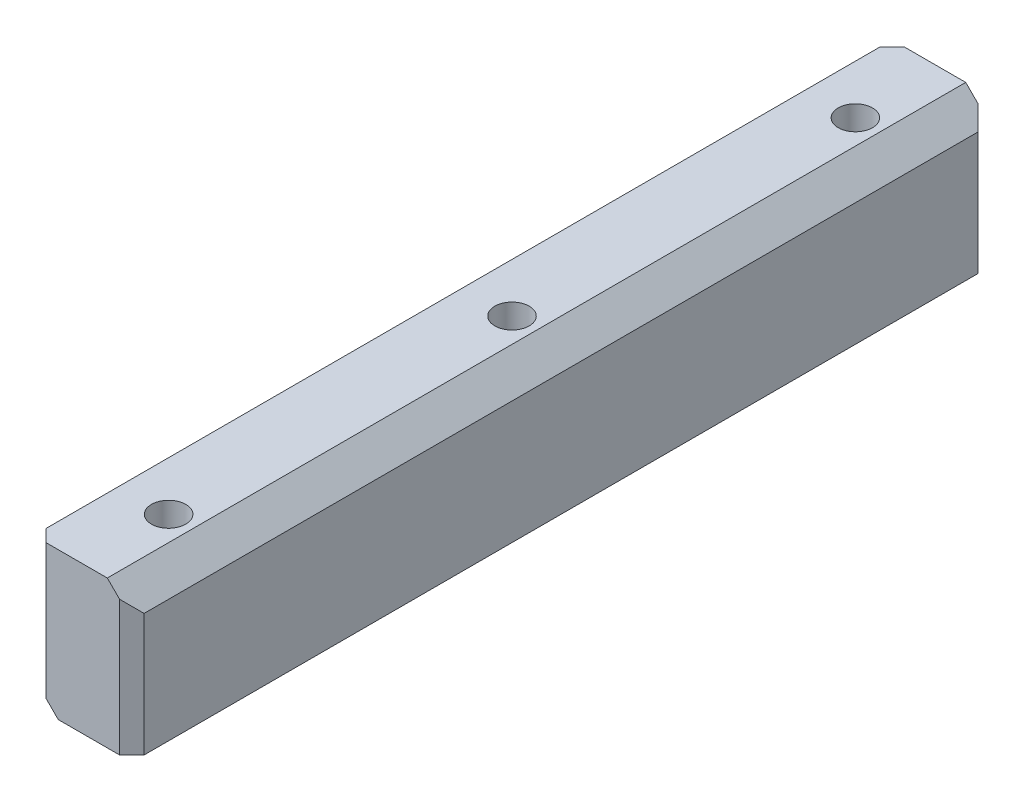
ISO-10303-21;
HEADER;
FILE_DESCRIPTION(('STEP AP214'),'2;1');
FILE_NAME('part.step','',(''),(''),'','','');
FILE_SCHEMA(('AUTOMOTIVE_DESIGN { 1 0 10303 214 1 1 1 1 }'));
ENDSEC;
DATA;
#1=APPLICATION_CONTEXT('core data for automotive mechanical design processes');
#2=APPLICATION_PROTOCOL_DEFINITION('international standard','automotive_design',2000,#1);
#3=PRODUCT_CONTEXT('',#1,'mechanical');
#4=PRODUCT('Part','Part','',(#3));
#5=PRODUCT_RELATED_PRODUCT_CATEGORY('part','',(#4));
#6=PRODUCT_DEFINITION_FORMATION('','',#4);
#7=PRODUCT_DEFINITION_CONTEXT('part definition',#1,'design');
#8=PRODUCT_DEFINITION('design','',#6,#7);
#9=PRODUCT_DEFINITION_SHAPE('','',#8);
#10=(LENGTH_UNIT() NAMED_UNIT(*) SI_UNIT(.MILLI.,.METRE.));
#11=(NAMED_UNIT(*) PLANE_ANGLE_UNIT() SI_UNIT($,.RADIAN.));
#12=(NAMED_UNIT(*) SI_UNIT($,.STERADIAN.) SOLID_ANGLE_UNIT());
#13=UNCERTAINTY_MEASURE_WITH_UNIT(LENGTH_MEASURE(1.E-05),#10,'distance_accuracy_value','');
#14=(GEOMETRIC_REPRESENTATION_CONTEXT(3) GLOBAL_UNCERTAINTY_ASSIGNED_CONTEXT((#13)) GLOBAL_UNIT_ASSIGNED_CONTEXT((#10,
#11,#12)) REPRESENTATION_CONTEXT('',''));
#15=CARTESIAN_POINT('',(0.,0.,0.));
#16=DIRECTION('',(0.,0.,1.));
#17=DIRECTION('',(1.,0.,0.));
#18=AXIS2_PLACEMENT_3D('',#15,#16,#17);
#19=CARTESIAN_POINT('',(0.,0.,350.));
#20=DIRECTION('',(0.,-1.,0.));
#21=DIRECTION('',(0.,0.,-1.));
#22=AXIS2_PLACEMENT_3D('',#19,#20,#21);
#23=PLANE('',#22);
#24=CARTESIAN_POINT('',(20.,0.,315.));
#25=DIRECTION('',(0.,1.,0.));
#26=DIRECTION('',(0.,0.,1.));
#27=AXIS2_PLACEMENT_3D('',#24,#25,#26);
#28=CIRCLE('',#27,6.99999999999999);
#29=CARTESIAN_POINT('',(20.,0.,322.));
#30=VERTEX_POINT('',#29);
#31=EDGE_CURVE('E268',#30,#30,#28,.T.);
#32=ORIENTED_EDGE('',*,*,#31,.F.);
#33=EDGE_LOOP('',(#32));
#34=FACE_BOUND('',#33,.T.);
#35=CARTESIAN_POINT('',(20.,0.,34.9999999999999));
#36=DIRECTION('',(0.,1.,0.));
#37=DIRECTION('',(0.,0.,1.));
#38=AXIS2_PLACEMENT_3D('',#35,#36,#37);
#39=CIRCLE('',#38,6.99999999999999);
#40=CARTESIAN_POINT('',(20.,0.,41.9999999999999));
#41=VERTEX_POINT('',#40);
#42=EDGE_CURVE('E149',#41,#41,#39,.T.);
#43=ORIENTED_EDGE('',*,*,#42,.F.);
#44=EDGE_LOOP('',(#43));
#45=FACE_BOUND('',#44,.T.);
#46=DIRECTION('',(-1.,0.,0.));
#47=VECTOR('',#46,1.);
#48=CARTESIAN_POINT('',(0.,0.,0.));
#49=LINE('',#48,#47);
#50=CARTESIAN_POINT('',(29.9999999999999,0.,0.));
#51=VERTEX_POINT('',#50);
#52=CARTESIAN_POINT('',(5.,0.,0.));
#53=VERTEX_POINT('',#52);
#54=EDGE_CURVE('E143',#51,#53,#49,.T.);
#55=ORIENTED_EDGE('',*,*,#54,.T.);
#56=DIRECTION('',(0.707106781186551,0.,-0.707106781186544));
#57=VECTOR('',#56,1.);
#58=CARTESIAN_POINT('',(0.,0.,4.99999999999995));
#59=LINE('',#58,#57);
#60=CARTESIAN_POINT('',(0.,0.,4.99999999999995));
#61=VERTEX_POINT('',#60);
#62=EDGE_CURVE('E197',#53,#61,#59,.F.);
#63=ORIENTED_EDGE('',*,*,#62,.T.);
#64=DIRECTION('',(0.,0.,-1.));
#65=VECTOR('',#64,1.);
#66=CARTESIAN_POINT('',(0.,0.,350.));
#67=LINE('',#66,#65);
#68=CARTESIAN_POINT('',(0.,0.,345.));
#69=VERTEX_POINT('',#68);
#70=EDGE_CURVE('E155',#69,#61,#67,.T.);
#71=ORIENTED_EDGE('',*,*,#70,.F.);
#72=DIRECTION('',(0.707106781186544,0.,0.707106781186551));
#73=VECTOR('',#72,1.);
#74=CARTESIAN_POINT('',(4.99999999999995,0.,350.));
#75=LINE('',#74,#73);
#76=CARTESIAN_POINT('',(4.99999999999995,0.,350.));
#77=VERTEX_POINT('',#76);
#78=EDGE_CURVE('E51',#69,#77,#75,.T.);
#79=ORIENTED_EDGE('',*,*,#78,.T.);
#80=DIRECTION('',(-1.,0.,0.));
#81=VECTOR('',#80,1.);
#82=CARTESIAN_POINT('',(0.,0.,350.));
#83=LINE('',#82,#81);
#84=CARTESIAN_POINT('',(29.9999999999999,0.,350.));
#85=VERTEX_POINT('',#84);
#86=EDGE_CURVE('E152',#85,#77,#83,.T.);
#87=ORIENTED_EDGE('',*,*,#86,.F.);
#88=DIRECTION('',(0.,0.,-1.));
#89=VECTOR('',#88,1.);
#90=CARTESIAN_POINT('',(29.9999999999999,0.,350.));
#91=LINE('',#90,#89);
#92=EDGE_CURVE('E167',#85,#51,#91,.T.);
#93=ORIENTED_EDGE('',*,*,#92,.T.);
#94=EDGE_LOOP('',(#55,#63,#71,#79,#87,#93));
#95=FACE_BOUND('',#94,.T.);
#96=CARTESIAN_POINT('',(20.,0.,175.));
#97=DIRECTION('',(0.,1.,0.));
#98=DIRECTION('',(0.,0.,1.));
#99=AXIS2_PLACEMENT_3D('',#96,#97,#98);
#100=CIRCLE('',#99,6.99999999999999);
#101=CARTESIAN_POINT('',(20.,0.,182.));
#102=VERTEX_POINT('',#101);
#103=EDGE_CURVE('E262',#102,#102,#100,.T.);
#104=ORIENTED_EDGE('',*,*,#103,.F.);
#105=EDGE_LOOP('',(#104));
#106=FACE_BOUND('',#105,.T.);
#107=ADVANCED_FACE('F36',(#34,#45,#95,#106),#23,.F.);
#108=CARTESIAN_POINT('',(0.,0.,350.));
#109=DIRECTION('',(1.,0.,0.));
#110=DIRECTION('',(0.,1.,0.));
#111=AXIS2_PLACEMENT_3D('',#108,#109,#110);
#112=PLANE('',#111);
#113=ORIENTED_EDGE('',*,*,#70,.T.);
#114=DIRECTION('',(0.,-1.,0.));
#115=VECTOR('',#114,1.);
#116=CARTESIAN_POINT('',(0.,0.,4.99999999999995));
#117=LINE('',#116,#115);
#118=CARTESIAN_POINT('',(0.,-50.,4.99999999999995));
#119=VERTEX_POINT('',#118);
#120=EDGE_CURVE('E191',#61,#119,#117,.T.);
#121=ORIENTED_EDGE('',*,*,#120,.T.);
#122=DIRECTION('',(0.,0.,1.));
#123=VECTOR('',#122,1.);
#124=CARTESIAN_POINT('',(0.,-50.,350.));
#125=LINE('',#124,#123);
#126=CARTESIAN_POINT('',(0.,-50.,345.));
#127=VERTEX_POINT('',#126);
#128=EDGE_CURVE('E126',#119,#127,#125,.T.);
#129=ORIENTED_EDGE('',*,*,#128,.T.);
#130=DIRECTION('',(0.,1.,0.));
#131=VECTOR('',#130,1.);
#132=CARTESIAN_POINT('',(0.,0.,345.));
#133=LINE('',#132,#131);
#134=EDGE_CURVE('E189',#127,#69,#133,.T.);
#135=ORIENTED_EDGE('',*,*,#134,.T.);
#136=EDGE_LOOP('',(#113,#121,#129,#135));
#137=FACE_BOUND('',#136,.T.);
#138=ADVANCED_FACE('F201',(#137),#112,.F.);
#139=CARTESIAN_POINT('',(0.,-60.,350.));
#140=DIRECTION('',(0.,1.,0.));
#141=DIRECTION('',(0.,0.,1.));
#142=AXIS2_PLACEMENT_3D('',#139,#140,#141);
#143=PLANE('',#142);
#144=CARTESIAN_POINT('',(20.,-60.,315.));
#145=DIRECTION('',(0.,1.,0.));
#146=DIRECTION('',(0.,0.,1.));
#147=AXIS2_PLACEMENT_3D('',#144,#145,#146);
#148=CIRCLE('',#147,6.99999999999999);
#149=CARTESIAN_POINT('',(20.,-60.,322.));
#150=VERTEX_POINT('',#149);
#151=EDGE_CURVE('E265',#150,#150,#148,.T.);
#152=ORIENTED_EDGE('',*,*,#151,.T.);
#153=EDGE_LOOP('',(#152));
#154=FACE_BOUND('',#153,.T.);
#155=CARTESIAN_POINT('',(20.,-60.,175.));
#156=DIRECTION('',(0.,1.,0.));
#157=DIRECTION('',(0.,0.,1.));
#158=AXIS2_PLACEMENT_3D('',#155,#156,#157);
#159=CIRCLE('',#158,6.99999999999999);
#160=CARTESIAN_POINT('',(20.,-60.,182.));
#161=VERTEX_POINT('',#160);
#162=EDGE_CURVE('E259',#161,#161,#159,.T.);
#163=ORIENTED_EDGE('',*,*,#162,.T.);
#164=EDGE_LOOP('',(#163));
#165=FACE_BOUND('',#164,.T.);
#166=CARTESIAN_POINT('',(20.,-60.,34.9999999999999));
#167=DIRECTION('',(0.,1.,0.));
#168=DIRECTION('',(0.,0.,1.));
#169=AXIS2_PLACEMENT_3D('',#166,#167,#168);
#170=CIRCLE('',#169,6.99999999999999);
#171=CARTESIAN_POINT('',(20.,-60.,41.9999999999999));
#172=VERTEX_POINT('',#171);
#173=EDGE_CURVE('E144',#172,#172,#170,.T.);
#174=ORIENTED_EDGE('',*,*,#173,.T.);
#175=EDGE_LOOP('',(#174));
#176=FACE_BOUND('',#175,.T.);
#177=DIRECTION('',(1.,0.,0.));
#178=VECTOR('',#177,1.);
#179=CARTESIAN_POINT('',(0.,-60.,0.));
#180=LINE('',#179,#178);
#181=CARTESIAN_POINT('',(9.99999999999996,-60.,0.));
#182=VERTEX_POINT('',#181);
#183=CARTESIAN_POINT('',(35.,-60.,0.));
#184=VERTEX_POINT('',#183);
#185=EDGE_CURVE('E133',#182,#184,#180,.T.);
#186=ORIENTED_EDGE('',*,*,#185,.T.);
#187=DIRECTION('',(-0.707106781186551,0.,-0.707106781186544));
#188=VECTOR('',#187,1.);
#189=CARTESIAN_POINT('',(40.,-60.,4.99999999999995));
#190=LINE('',#189,#188);
#191=CARTESIAN_POINT('',(40.,-60.,4.99999999999995));
#192=VERTEX_POINT('',#191);
#193=EDGE_CURVE('E187',#184,#192,#190,.F.);
#194=ORIENTED_EDGE('',*,*,#193,.T.);
#195=DIRECTION('',(0.,0.,-1.));
#196=VECTOR('',#195,1.);
#197=CARTESIAN_POINT('',(40.,-60.,350.));
#198=LINE('',#197,#196);
#199=CARTESIAN_POINT('',(40.,-60.,345.));
#200=VERTEX_POINT('',#199);
#201=EDGE_CURVE('E137',#200,#192,#198,.T.);
#202=ORIENTED_EDGE('',*,*,#201,.F.);
#203=DIRECTION('',(-0.707106781186544,0.,0.707106781186551));
#204=VECTOR('',#203,1.);
#205=CARTESIAN_POINT('',(35.0000000000001,-60.,350.));
#206=LINE('',#205,#204);
#207=CARTESIAN_POINT('',(35.0000000000001,-60.,350.));
#208=VERTEX_POINT('',#207);
#209=EDGE_CURVE('E185',#200,#208,#206,.T.);
#210=ORIENTED_EDGE('',*,*,#209,.T.);
#211=DIRECTION('',(1.,0.,0.));
#212=VECTOR('',#211,1.);
#213=CARTESIAN_POINT('',(0.,-60.,350.));
#214=LINE('',#213,#212);
#215=CARTESIAN_POINT('',(9.99999999999996,-60.,350.));
#216=VERTEX_POINT('',#215);
#217=EDGE_CURVE('E136',#216,#208,#214,.T.);
#218=ORIENTED_EDGE('',*,*,#217,.F.);
#219=DIRECTION('',(0.,0.,-1.));
#220=VECTOR('',#219,1.);
#221=CARTESIAN_POINT('',(9.99999999999996,-60.,350.));
#222=LINE('',#221,#220);
#223=EDGE_CURVE('E121',#216,#182,#222,.T.);
#224=ORIENTED_EDGE('',*,*,#223,.T.);
#225=EDGE_LOOP('',(#186,#194,#202,#210,#218,#224));
#226=FACE_BOUND('',#225,.T.);
#227=ADVANCED_FACE('F132',(#154,#165,#176,#226),#143,.F.);
#228=CARTESIAN_POINT('',(40.,0.,350.));
#229=DIRECTION('',(-1.,0.,0.));
#230=DIRECTION('',(0.,-1.,0.));
#231=AXIS2_PLACEMENT_3D('',#228,#229,#230);
#232=PLANE('',#231);
#233=ORIENTED_EDGE('',*,*,#201,.T.);
#234=DIRECTION('',(0.,1.,0.));
#235=VECTOR('',#234,1.);
#236=CARTESIAN_POINT('',(40.,0.,4.99999999999995));
#237=LINE('',#236,#235);
#238=CARTESIAN_POINT('',(40.,-10.0000000000001,4.99999999999995));
#239=VERTEX_POINT('',#238);
#240=EDGE_CURVE('E175',#192,#239,#237,.T.);
#241=ORIENTED_EDGE('',*,*,#240,.T.);
#242=DIRECTION('',(0.,0.,1.));
#243=VECTOR('',#242,1.);
#244=CARTESIAN_POINT('',(40.,-10.0000000000001,350.));
#245=LINE('',#244,#243);
#246=CARTESIAN_POINT('',(40.,-10.0000000000001,345.));
#247=VERTEX_POINT('',#246);
#248=EDGE_CURVE('E170',#239,#247,#245,.T.);
#249=ORIENTED_EDGE('',*,*,#248,.T.);
#250=DIRECTION('',(0.,-1.,0.));
#251=VECTOR('',#250,1.);
#252=CARTESIAN_POINT('',(40.,-60.,345.));
#253=LINE('',#252,#251);
#254=EDGE_CURVE('E173',#247,#200,#253,.T.);
#255=ORIENTED_EDGE('',*,*,#254,.T.);
#256=EDGE_LOOP('',(#233,#241,#249,#255));
#257=FACE_BOUND('',#256,.T.);
#258=ADVANCED_FACE('F222',(#257),#232,.F.);
#259=CARTESIAN_POINT('',(0.,0.,350.));
#260=DIRECTION('',(0.,0.,1.));
#261=DIRECTION('',(1.,0.,0.));
#262=AXIS2_PLACEMENT_3D('',#259,#260,#261);
#263=PLANE('',#262);
#264=ORIENTED_EDGE('',*,*,#217,.T.);
#265=DIRECTION('',(0.,1.,0.));
#266=VECTOR('',#265,1.);
#267=CARTESIAN_POINT('',(35.,-10.0000000000001,350.));
#268=LINE('',#267,#266);
#269=CARTESIAN_POINT('',(35.0000000000001,-5.00000000000012,350.));
#270=VERTEX_POINT('',#269);
#271=EDGE_CURVE('E11',#208,#270,#268,.T.);
#272=ORIENTED_EDGE('',*,*,#271,.T.);
#273=DIRECTION('',(0.707106781186548,-0.707106781186548,0.));
#274=VECTOR('',#273,1.);
#275=CARTESIAN_POINT('',(15.,15.,350.));
#276=LINE('',#275,#274);
#277=EDGE_CURVE('E163',#270,#85,#276,.F.);
#278=ORIENTED_EDGE('',*,*,#277,.T.);
#279=ORIENTED_EDGE('',*,*,#86,.T.);
#280=DIRECTION('',(0.,-1.,0.));
#281=VECTOR('',#280,1.);
#282=CARTESIAN_POINT('',(4.99999999999995,-50.,350.));
#283=LINE('',#282,#281);
#284=CARTESIAN_POINT('',(4.99999999999995,-55.,350.));
#285=VERTEX_POINT('',#284);
#286=EDGE_CURVE('E44',#77,#285,#283,.T.);
#287=ORIENTED_EDGE('',*,*,#286,.T.);
#288=DIRECTION('',(-0.707106781186546,0.707106781186549,0.));
#289=VECTOR('',#288,1.);
#290=CARTESIAN_POINT('',(-25.,-24.9999999999999,350.));
#291=LINE('',#290,#289);
#292=EDGE_CURVE('E165',#285,#216,#291,.F.);
#293=ORIENTED_EDGE('',*,*,#292,.T.);
#294=EDGE_LOOP('',(#264,#272,#278,#279,#287,#293));
#295=FACE_BOUND('',#294,.T.);
#296=ADVANCED_FACE('F199',(#295),#263,.T.);
#297=CARTESIAN_POINT('',(0.,0.,0.));
#298=DIRECTION('',(0.,0.,1.));
#299=DIRECTION('',(1.,0.,0.));
#300=AXIS2_PLACEMENT_3D('',#297,#298,#299);
#301=PLANE('',#300);
#302=DIRECTION('',(-0.707106781186548,0.707106781186548,0.));
#303=VECTOR('',#302,1.);
#304=CARTESIAN_POINT('',(29.9999999999999,0.,0.));
#305=LINE('',#304,#303);
#306=CARTESIAN_POINT('',(35.,-5.00000000000006,0.));
#307=VERTEX_POINT('',#306);
#308=EDGE_CURVE('E127',#51,#307,#305,.F.);
#309=ORIENTED_EDGE('',*,*,#308,.T.);
#310=DIRECTION('',(0.,-1.,0.));
#311=VECTOR('',#310,1.);
#312=CARTESIAN_POINT('',(35.,0.,0.));
#313=LINE('',#312,#311);
#314=EDGE_CURVE('E142',#307,#184,#313,.T.);
#315=ORIENTED_EDGE('',*,*,#314,.T.);
#316=ORIENTED_EDGE('',*,*,#185,.F.);
#317=DIRECTION('',(0.707106781186546,-0.707106781186549,0.));
#318=VECTOR('',#317,1.);
#319=CARTESIAN_POINT('',(9.99999999999996,-60.,0.));
#320=LINE('',#319,#318);
#321=CARTESIAN_POINT('',(5.00000000000001,-55.,0.));
#322=VERTEX_POINT('',#321);
#323=EDGE_CURVE('E116',#182,#322,#320,.F.);
#324=ORIENTED_EDGE('',*,*,#323,.T.);
#325=DIRECTION('',(0.,1.,0.));
#326=VECTOR('',#325,1.);
#327=CARTESIAN_POINT('',(5.,0.,0.));
#328=LINE('',#327,#326);
#329=EDGE_CURVE('E182',#322,#53,#328,.T.);
#330=ORIENTED_EDGE('',*,*,#329,.T.);
#331=ORIENTED_EDGE('',*,*,#54,.F.);
#332=EDGE_LOOP('',(#309,#315,#316,#324,#330,#331));
#333=FACE_BOUND('',#332,.T.);
#334=ADVANCED_FACE('F140',(#333),#301,.F.);
#335=CARTESIAN_POINT('',(9.99999999999996,-60.,350.));
#336=DIRECTION('',(0.707106781186549,0.707106781186546,0.));
#337=DIRECTION('',(0.,0.,-1.));
#338=AXIS2_PLACEMENT_3D('',#335,#336,#337);
#339=PLANE('',#338);
#340=ORIENTED_EDGE('',*,*,#128,.F.);
#341=DIRECTION('',(0.577350269189627,-0.57735026918963,-0.57735026918962));
#342=VECTOR('',#341,1.);
#343=CARTESIAN_POINT('',(-108.333333333332,58.3333333333331,113.333333333331));
#344=LINE('',#343,#342);
#345=EDGE_CURVE('E122',#119,#322,#344,.T.);
#346=ORIENTED_EDGE('',*,*,#345,.T.);
#347=ORIENTED_EDGE('',*,*,#323,.F.);
#348=ORIENTED_EDGE('',*,*,#223,.F.);
#349=ORIENTED_EDGE('',*,*,#292,.F.);
#350=DIRECTION('',(0.577350269189623,-0.577350269189626,0.577350269189629));
#351=VECTOR('',#350,1.);
#352=CARTESIAN_POINT('',(8.33333333333327,-58.3333333333333,353.333333333333));
#353=LINE('',#352,#351);
#354=EDGE_CURVE('E59',#285,#127,#353,.F.);
#355=ORIENTED_EDGE('',*,*,#354,.T.);
#356=EDGE_LOOP('',(#340,#346,#347,#348,#349,#355));
#357=FACE_BOUND('',#356,.T.);
#358=ADVANCED_FACE('F119',(#357),#339,.F.);
#359=CARTESIAN_POINT('',(29.9999999999999,0.,350.));
#360=DIRECTION('',(-0.707106781186547,-0.707106781186547,0.));
#361=DIRECTION('',(0.,0.,-1.));
#362=AXIS2_PLACEMENT_3D('',#359,#360,#361);
#363=PLANE('',#362);
#364=ORIENTED_EDGE('',*,*,#248,.F.);
#365=DIRECTION('',(-0.577350269189628,0.577350269189628,-0.577350269189621));
#366=VECTOR('',#365,1.);
#367=CARTESIAN_POINT('',(148.333333333333,-118.333333333333,113.333333333332));
#368=LINE('',#367,#366);
#369=EDGE_CURVE('E180',#239,#307,#368,.T.);
#370=ORIENTED_EDGE('',*,*,#369,.T.);
#371=ORIENTED_EDGE('',*,*,#308,.F.);
#372=ORIENTED_EDGE('',*,*,#92,.F.);
#373=ORIENTED_EDGE('',*,*,#277,.F.);
#374=DIRECTION('',(-0.577350269189624,0.577350269189624,0.57735026918963));
#375=VECTOR('',#374,1.);
#376=CARTESIAN_POINT('',(31.6666666666667,-1.66666666666673,353.333333333333));
#377=LINE('',#376,#375);
#378=EDGE_CURVE('E178',#270,#247,#377,.F.);
#379=ORIENTED_EDGE('',*,*,#378,.T.);
#380=EDGE_LOOP('',(#364,#370,#371,#372,#373,#379));
#381=FACE_BOUND('',#380,.T.);
#382=ADVANCED_FACE('F231',(#381),#363,.F.);
#383=CARTESIAN_POINT('',(20.,0.,34.9999999999999));
#384=DIRECTION('',(0.,1.,0.));
#385=DIRECTION('',(0.,0.,1.));
#386=AXIS2_PLACEMENT_3D('',#383,#384,#385);
#387=CYLINDRICAL_SURFACE('',#386,6.99999999999999);
#388=ORIENTED_EDGE('',*,*,#173,.F.);
#389=EDGE_LOOP('',(#388));
#390=FACE_BOUND('',#389,.T.);
#391=ORIENTED_EDGE('',*,*,#42,.T.);
#392=EDGE_LOOP('',(#391));
#393=FACE_BOUND('',#392,.T.);
#394=ADVANCED_FACE('F234',(#390,#393),#387,.F.);
#395=CARTESIAN_POINT('',(20.,0.,175.));
#396=DIRECTION('',(0.,1.,0.));
#397=DIRECTION('',(0.,0.,1.));
#398=AXIS2_PLACEMENT_3D('',#395,#396,#397);
#399=CYLINDRICAL_SURFACE('',#398,6.99999999999999);
#400=ORIENTED_EDGE('',*,*,#162,.F.);
#401=EDGE_LOOP('',(#400));
#402=FACE_BOUND('',#401,.T.);
#403=ORIENTED_EDGE('',*,*,#103,.T.);
#404=EDGE_LOOP('',(#403));
#405=FACE_BOUND('',#404,.T.);
#406=ADVANCED_FACE('F272',(#402,#405),#399,.F.);
#407=CARTESIAN_POINT('',(20.,0.,315.));
#408=DIRECTION('',(0.,1.,0.));
#409=DIRECTION('',(0.,0.,1.));
#410=AXIS2_PLACEMENT_3D('',#407,#408,#409);
#411=CYLINDRICAL_SURFACE('',#410,6.99999999999999);
#412=ORIENTED_EDGE('',*,*,#151,.F.);
#413=EDGE_LOOP('',(#412));
#414=FACE_BOUND('',#413,.T.);
#415=ORIENTED_EDGE('',*,*,#31,.T.);
#416=EDGE_LOOP('',(#415));
#417=FACE_BOUND('',#416,.T.);
#418=ADVANCED_FACE('F239',(#414,#417),#411,.F.);
#419=CARTESIAN_POINT('',(40.,0.,4.99999999999995));
#420=DIRECTION('',(-0.707106781186544,0.,0.707106781186551));
#421=DIRECTION('',(0.,1.,0.));
#422=AXIS2_PLACEMENT_3D('',#419,#420,#421);
#423=PLANE('',#422);
#424=ORIENTED_EDGE('',*,*,#193,.F.);
#425=ORIENTED_EDGE('',*,*,#314,.F.);
#426=ORIENTED_EDGE('',*,*,#369,.F.);
#427=ORIENTED_EDGE('',*,*,#240,.F.);
#428=EDGE_LOOP('',(#424,#425,#426,#427));
#429=FACE_BOUND('',#428,.T.);
#430=ADVANCED_FACE('F236',(#429),#423,.F.);
#431=CARTESIAN_POINT('',(0.,0.,4.99999999999995));
#432=DIRECTION('',(0.707106781186544,0.,0.707106781186551));
#433=DIRECTION('',(0.,-1.,0.));
#434=AXIS2_PLACEMENT_3D('',#431,#432,#433);
#435=PLANE('',#434);
#436=ORIENTED_EDGE('',*,*,#62,.F.);
#437=ORIENTED_EDGE('',*,*,#329,.F.);
#438=ORIENTED_EDGE('',*,*,#345,.F.);
#439=ORIENTED_EDGE('',*,*,#120,.F.);
#440=EDGE_LOOP('',(#436,#437,#438,#439));
#441=FACE_BOUND('',#440,.T.);
#442=ADVANCED_FACE('F208',(#441),#435,.F.);
#443=CARTESIAN_POINT('',(35.,0.,350.));
#444=DIRECTION('',(0.707106781186551,0.,0.707106781186544));
#445=DIRECTION('',(0.,-1.,0.));
#446=AXIS2_PLACEMENT_3D('',#443,#444,#445);
#447=PLANE('',#446);
#448=ORIENTED_EDGE('',*,*,#209,.F.);
#449=ORIENTED_EDGE('',*,*,#254,.F.);
#450=ORIENTED_EDGE('',*,*,#378,.F.);
#451=ORIENTED_EDGE('',*,*,#271,.F.);
#452=EDGE_LOOP('',(#448,#449,#450,#451));
#453=FACE_BOUND('',#452,.T.);
#454=ADVANCED_FACE('F204',(#453),#447,.T.);
#455=CARTESIAN_POINT('',(4.99999999999995,0.,350.));
#456=DIRECTION('',(-0.707106781186551,0.,0.707106781186544));
#457=DIRECTION('',(0.,1.,0.));
#458=AXIS2_PLACEMENT_3D('',#455,#456,#457);
#459=PLANE('',#458);
#460=ORIENTED_EDGE('',*,*,#78,.F.);
#461=ORIENTED_EDGE('',*,*,#134,.F.);
#462=ORIENTED_EDGE('',*,*,#354,.F.);
#463=ORIENTED_EDGE('',*,*,#286,.F.);
#464=EDGE_LOOP('',(#460,#461,#462,#463));
#465=FACE_BOUND('',#464,.T.);
#466=ADVANCED_FACE('F38',(#465),#459,.T.);
#467=CLOSED_SHELL('',(#107,#138,#227,#258,#296,#334,#358,#382,#394,#406,#418,#430,#442,#454,#466));
#468=MANIFOLD_SOLID_BREP('B2',#467);
#469=ADVANCED_BREP_SHAPE_REPRESENTATION('',(#18,#468),#14);
#470=SHAPE_DEFINITION_REPRESENTATION(#9,#469);
ENDSEC;
END-ISO-10303-21;
